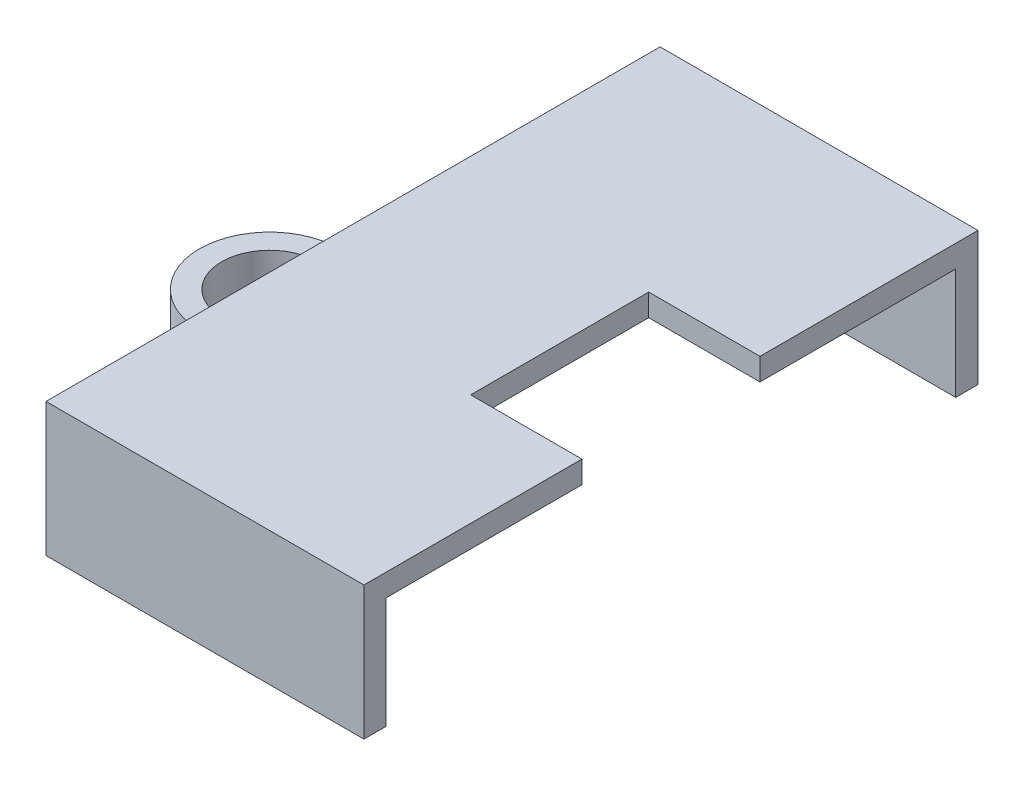
ISO-10303-21;
HEADER;
FILE_DESCRIPTION(('STEP AP214'),'2;1');
FILE_NAME('part.step','',(''),(''),'','','');
FILE_SCHEMA(('AUTOMOTIVE_DESIGN { 1 0 10303 214 1 1 1 1 }'));
ENDSEC;
DATA;
#1=APPLICATION_CONTEXT('core data for automotive mechanical design processes');
#2=APPLICATION_PROTOCOL_DEFINITION('international standard','automotive_design',2000,#1);
#3=PRODUCT_CONTEXT('',#1,'mechanical');
#4=PRODUCT('Part','Part','',(#3));
#5=PRODUCT_RELATED_PRODUCT_CATEGORY('part','',(#4));
#6=PRODUCT_DEFINITION_FORMATION('','',#4);
#7=PRODUCT_DEFINITION_CONTEXT('part definition',#1,'design');
#8=PRODUCT_DEFINITION('design','',#6,#7);
#9=PRODUCT_DEFINITION_SHAPE('','',#8);
#10=(LENGTH_UNIT() NAMED_UNIT(*) SI_UNIT(.MILLI.,.METRE.));
#11=(NAMED_UNIT(*) PLANE_ANGLE_UNIT() SI_UNIT($,.RADIAN.));
#12=(NAMED_UNIT(*) SI_UNIT($,.STERADIAN.) SOLID_ANGLE_UNIT());
#13=UNCERTAINTY_MEASURE_WITH_UNIT(LENGTH_MEASURE(1.E-05),#10,'distance_accuracy_value','');
#14=(GEOMETRIC_REPRESENTATION_CONTEXT(3) GLOBAL_UNCERTAINTY_ASSIGNED_CONTEXT((#13)) GLOBAL_UNIT_ASSIGNED_CONTEXT((#10,
#11,#12)) REPRESENTATION_CONTEXT('',''));
#15=CARTESIAN_POINT('',(0.,0.,0.));
#16=DIRECTION('',(0.,0.,1.));
#17=DIRECTION('',(1.,0.,0.));
#18=AXIS2_PLACEMENT_3D('',#15,#16,#17);
#19=CARTESIAN_POINT('',(0.,6.,13.7963481159043));
#20=DIRECTION('',(0.,0.,1.));
#21=DIRECTION('',(1.,0.,0.));
#22=AXIS2_PLACEMENT_3D('',#19,#20,#21);
#23=PLANE('',#22);
#24=DIRECTION('',(0.,-1.,0.));
#25=VECTOR('',#24,1.);
#26=CARTESIAN_POINT('',(3.75,6.,13.7963481159043));
#27=LINE('',#26,#25);
#28=CARTESIAN_POINT('',(3.75,6.,13.7963481159043));
#29=VERTEX_POINT('',#28);
#30=CARTESIAN_POINT('',(3.75,0.,13.7963481159043));
#31=VERTEX_POINT('',#30);
#32=EDGE_CURVE('E256',#29,#31,#27,.T.);
#33=ORIENTED_EDGE('',*,*,#32,.T.);
#34=DIRECTION('',(-1.,0.,0.));
#35=VECTOR('',#34,1.);
#36=CARTESIAN_POINT('',(0.,0.,13.7963481159043));
#37=LINE('',#36,#35);
#38=CARTESIAN_POINT('',(18.035,0.,13.7963481159043));
#39=VERTEX_POINT('',#38);
#40=EDGE_CURVE('E199',#39,#31,#37,.T.);
#41=ORIENTED_EDGE('',*,*,#40,.F.);
#42=DIRECTION('',(0.,-1.,0.));
#43=VECTOR('',#42,1.);
#44=CARTESIAN_POINT('',(18.035,6.,13.7963481159043));
#45=LINE('',#44,#43);
#46=CARTESIAN_POINT('',(18.035,6.,13.7963481159043));
#47=VERTEX_POINT('',#46);
#48=EDGE_CURVE('E11',#47,#39,#45,.T.);
#49=ORIENTED_EDGE('',*,*,#48,.F.);
#50=DIRECTION('',(-1.,0.,0.));
#51=VECTOR('',#50,1.);
#52=CARTESIAN_POINT('',(0.,6.,13.7963481159043));
#53=LINE('',#52,#51);
#54=EDGE_CURVE('E231',#47,#29,#53,.T.);
#55=ORIENTED_EDGE('',*,*,#54,.T.);
#56=EDGE_LOOP('',(#33,#41,#49,#55));
#57=FACE_BOUND('',#56,.T.);
#58=ADVANCED_FACE('F41',(#57),#23,.T.);
#59=CARTESIAN_POINT('',(18.035,6.,0.));
#60=DIRECTION('',(1.,0.,0.));
#61=DIRECTION('',(0.,0.,-1.));
#62=AXIS2_PLACEMENT_3D('',#59,#60,#61);
#63=PLANE('',#62);
#64=DIRECTION('',(0.,0.,1.));
#65=VECTOR('',#64,1.);
#66=CARTESIAN_POINT('',(18.035,5.,0.));
#67=LINE('',#66,#65);
#68=CARTESIAN_POINT('',(18.035,5.,4.));
#69=VERTEX_POINT('',#68);
#70=CARTESIAN_POINT('',(18.035,5.,12.7963481159043));
#71=VERTEX_POINT('',#70);
#72=EDGE_CURVE('E230',#69,#71,#67,.T.);
#73=ORIENTED_EDGE('',*,*,#72,.F.);
#74=DIRECTION('',(0.,-1.,0.));
#75=VECTOR('',#74,1.);
#76=CARTESIAN_POINT('',(18.035,6.,4.));
#77=LINE('',#76,#75);
#78=CARTESIAN_POINT('',(18.035,6.,4.));
#79=VERTEX_POINT('',#78);
#80=EDGE_CURVE('E48',#79,#69,#77,.T.);
#81=ORIENTED_EDGE('',*,*,#80,.F.);
#82=DIRECTION('',(0.,0.,1.));
#83=VECTOR('',#82,1.);
#84=CARTESIAN_POINT('',(18.035,6.,0.));
#85=LINE('',#84,#83);
#86=EDGE_CURVE('E234',#79,#47,#85,.T.);
#87=ORIENTED_EDGE('',*,*,#86,.T.);
#88=ORIENTED_EDGE('',*,*,#48,.T.);
#89=DIRECTION('',(0.,0.,1.));
#90=VECTOR('',#89,1.);
#91=CARTESIAN_POINT('',(18.035,0.,0.));
#92=LINE('',#91,#90);
#93=CARTESIAN_POINT('',(18.035,0.,12.7963481159043));
#94=VERTEX_POINT('',#93);
#95=EDGE_CURVE('E195',#94,#39,#92,.T.);
#96=ORIENTED_EDGE('',*,*,#95,.F.);
#97=DIRECTION('',(0.,-1.,0.));
#98=VECTOR('',#97,1.);
#99=CARTESIAN_POINT('',(18.035,36.0711781292706,12.7963481159043));
#100=LINE('',#99,#98);
#101=EDGE_CURVE('E222',#71,#94,#100,.T.);
#102=ORIENTED_EDGE('',*,*,#101,.F.);
#103=EDGE_LOOP('',(#73,#81,#87,#88,#96,#102));
#104=FACE_BOUND('',#103,.T.);
#105=ADVANCED_FACE('F288',(#104),#63,.T.);
#106=CARTESIAN_POINT('',(0.,6.,4.));
#107=DIRECTION('',(0.,0.,-1.));
#108=DIRECTION('',(-1.,0.,0.));
#109=AXIS2_PLACEMENT_3D('',#106,#107,#108);
#110=PLANE('',#109);
#111=DIRECTION('',(1.,0.,0.));
#112=VECTOR('',#111,1.);
#113=CARTESIAN_POINT('',(0.,5.,4.));
#114=LINE('',#113,#112);
#115=CARTESIAN_POINT('',(13.035,5.,4.));
#116=VERTEX_POINT('',#115);
#117=EDGE_CURVE('E258',#116,#69,#114,.T.);
#118=ORIENTED_EDGE('',*,*,#117,.F.);
#119=DIRECTION('',(0.,-1.,0.));
#120=VECTOR('',#119,1.);
#121=CARTESIAN_POINT('',(13.035,6.,4.));
#122=LINE('',#121,#120);
#123=CARTESIAN_POINT('',(13.035,6.,4.));
#124=VERTEX_POINT('',#123);
#125=EDGE_CURVE('E279',#124,#116,#122,.T.);
#126=ORIENTED_EDGE('',*,*,#125,.F.);
#127=DIRECTION('',(1.,0.,0.));
#128=VECTOR('',#127,1.);
#129=CARTESIAN_POINT('',(0.,6.,4.));
#130=LINE('',#129,#128);
#131=EDGE_CURVE('E238',#124,#79,#130,.T.);
#132=ORIENTED_EDGE('',*,*,#131,.T.);
#133=ORIENTED_EDGE('',*,*,#80,.T.);
#134=EDGE_LOOP('',(#118,#126,#132,#133));
#135=FACE_BOUND('',#134,.T.);
#136=ADVANCED_FACE('F283',(#135),#110,.T.);
#137=CARTESIAN_POINT('',(13.035,6.,0.));
#138=DIRECTION('',(1.,0.,0.));
#139=DIRECTION('',(0.,0.,-1.));
#140=AXIS2_PLACEMENT_3D('',#137,#138,#139);
#141=PLANE('',#140);
#142=DIRECTION('',(0.,0.,1.));
#143=VECTOR('',#142,1.);
#144=CARTESIAN_POINT('',(13.035,5.,0.));
#145=LINE('',#144,#143);
#146=CARTESIAN_POINT('',(13.035,5.,-4.));
#147=VERTEX_POINT('',#146);
#148=EDGE_CURVE('E261',#147,#116,#145,.T.);
#149=ORIENTED_EDGE('',*,*,#148,.F.);
#150=DIRECTION('',(0.,-1.,0.));
#151=VECTOR('',#150,1.);
#152=CARTESIAN_POINT('',(13.035,6.,-4.));
#153=LINE('',#152,#151);
#154=CARTESIAN_POINT('',(13.035,6.,-4.));
#155=VERTEX_POINT('',#154);
#156=EDGE_CURVE('E277',#155,#147,#153,.T.);
#157=ORIENTED_EDGE('',*,*,#156,.F.);
#158=DIRECTION('',(0.,0.,1.));
#159=VECTOR('',#158,1.);
#160=CARTESIAN_POINT('',(13.035,6.,0.));
#161=LINE('',#160,#159);
#162=EDGE_CURVE('E241',#155,#124,#161,.T.);
#163=ORIENTED_EDGE('',*,*,#162,.T.);
#164=ORIENTED_EDGE('',*,*,#125,.T.);
#165=EDGE_LOOP('',(#149,#157,#163,#164));
#166=FACE_BOUND('',#165,.T.);
#167=ADVANCED_FACE('F294',(#166),#141,.T.);
#168=CARTESIAN_POINT('',(0.,6.,-4.));
#169=DIRECTION('',(0.,0.,1.));
#170=DIRECTION('',(1.,0.,0.));
#171=AXIS2_PLACEMENT_3D('',#168,#169,#170);
#172=PLANE('',#171);
#173=DIRECTION('',(-1.,0.,0.));
#174=VECTOR('',#173,1.);
#175=CARTESIAN_POINT('',(0.,5.,-4.));
#176=LINE('',#175,#174);
#177=CARTESIAN_POINT('',(18.035,5.,-4.));
#178=VERTEX_POINT('',#177);
#179=EDGE_CURVE('E264',#178,#147,#176,.T.);
#180=ORIENTED_EDGE('',*,*,#179,.F.);
#181=DIRECTION('',(0.,-1.,0.));
#182=VECTOR('',#181,1.);
#183=CARTESIAN_POINT('',(18.035,6.,-4.));
#184=LINE('',#183,#182);
#185=CARTESIAN_POINT('',(18.035,6.,-4.));
#186=VERTEX_POINT('',#185);
#187=EDGE_CURVE('E274',#186,#178,#184,.T.);
#188=ORIENTED_EDGE('',*,*,#187,.F.);
#189=DIRECTION('',(-1.,0.,0.));
#190=VECTOR('',#189,1.);
#191=CARTESIAN_POINT('',(0.,6.,-4.));
#192=LINE('',#191,#190);
#193=EDGE_CURVE('E244',#186,#155,#192,.T.);
#194=ORIENTED_EDGE('',*,*,#193,.T.);
#195=ORIENTED_EDGE('',*,*,#156,.T.);
#196=EDGE_LOOP('',(#180,#188,#194,#195));
#197=FACE_BOUND('',#196,.T.);
#198=ADVANCED_FACE('F325',(#197),#172,.T.);
#199=CARTESIAN_POINT('',(18.035,6.,0.));
#200=DIRECTION('',(1.,0.,0.));
#201=DIRECTION('',(0.,0.,-1.));
#202=AXIS2_PLACEMENT_3D('',#199,#200,#201);
#203=PLANE('',#202);
#204=DIRECTION('',(0.,0.,1.));
#205=VECTOR('',#204,1.);
#206=CARTESIAN_POINT('',(18.035,5.,0.));
#207=LINE('',#206,#205);
#208=CARTESIAN_POINT('',(18.035,5.,-12.7963481159043));
#209=VERTEX_POINT('',#208);
#210=EDGE_CURVE('E235',#209,#178,#207,.T.);
#211=ORIENTED_EDGE('',*,*,#210,.F.);
#212=DIRECTION('',(0.,-1.,0.));
#213=VECTOR('',#212,1.);
#214=CARTESIAN_POINT('',(18.035,36.0711781292706,-12.7963481159043));
#215=LINE('',#214,#213);
#216=CARTESIAN_POINT('',(18.035,0.,-12.7963481159043));
#217=VERTEX_POINT('',#216);
#218=EDGE_CURVE('E206',#209,#217,#215,.T.);
#219=ORIENTED_EDGE('',*,*,#218,.T.);
#220=DIRECTION('',(0.,0.,1.));
#221=VECTOR('',#220,1.);
#222=CARTESIAN_POINT('',(18.035,0.,0.));
#223=LINE('',#222,#221);
#224=CARTESIAN_POINT('',(18.035,0.,-13.7963481159043));
#225=VERTEX_POINT('',#224);
#226=EDGE_CURVE('E210',#225,#217,#223,.T.);
#227=ORIENTED_EDGE('',*,*,#226,.F.);
#228=DIRECTION('',(0.,-1.,0.));
#229=VECTOR('',#228,1.);
#230=CARTESIAN_POINT('',(18.035,6.,-13.7963481159043));
#231=LINE('',#230,#229);
#232=CARTESIAN_POINT('',(18.035,6.,-13.7963481159043));
#233=VERTEX_POINT('',#232);
#234=EDGE_CURVE('E272',#233,#225,#231,.T.);
#235=ORIENTED_EDGE('',*,*,#234,.F.);
#236=DIRECTION('',(0.,0.,1.));
#237=VECTOR('',#236,1.);
#238=CARTESIAN_POINT('',(18.035,6.,0.));
#239=LINE('',#238,#237);
#240=EDGE_CURVE('E247',#233,#186,#239,.T.);
#241=ORIENTED_EDGE('',*,*,#240,.T.);
#242=ORIENTED_EDGE('',*,*,#187,.T.);
#243=EDGE_LOOP('',(#211,#219,#227,#235,#241,#242));
#244=FACE_BOUND('',#243,.T.);
#245=ADVANCED_FACE('F321',(#244),#203,.T.);
#246=CARTESIAN_POINT('',(0.,6.,-13.7963481159043));
#247=DIRECTION('',(0.,0.,-1.));
#248=DIRECTION('',(-1.,0.,0.));
#249=AXIS2_PLACEMENT_3D('',#246,#247,#248);
#250=PLANE('',#249);
#251=ORIENTED_EDGE('',*,*,#234,.T.);
#252=DIRECTION('',(1.,0.,0.));
#253=VECTOR('',#252,1.);
#254=CARTESIAN_POINT('',(0.,0.,-13.7963481159043));
#255=LINE('',#254,#253);
#256=CARTESIAN_POINT('',(3.75,0.,-13.7963481159043));
#257=VERTEX_POINT('',#256);
#258=EDGE_CURVE('E202',#257,#225,#255,.T.);
#259=ORIENTED_EDGE('',*,*,#258,.F.);
#260=DIRECTION('',(0.,-1.,0.));
#261=VECTOR('',#260,1.);
#262=CARTESIAN_POINT('',(3.75,6.,-13.7963481159043));
#263=LINE('',#262,#261);
#264=CARTESIAN_POINT('',(3.75,6.,-13.7963481159043));
#265=VERTEX_POINT('',#264);
#266=EDGE_CURVE('E270',#265,#257,#263,.T.);
#267=ORIENTED_EDGE('',*,*,#266,.F.);
#268=DIRECTION('',(1.,0.,0.));
#269=VECTOR('',#268,1.);
#270=CARTESIAN_POINT('',(0.,6.,-13.7963481159043));
#271=LINE('',#270,#269);
#272=EDGE_CURVE('E250',#265,#233,#271,.T.);
#273=ORIENTED_EDGE('',*,*,#272,.T.);
#274=EDGE_LOOP('',(#251,#259,#267,#273));
#275=FACE_BOUND('',#274,.T.);
#276=ADVANCED_FACE('F328',(#275),#250,.T.);
#277=CARTESIAN_POINT('',(3.75,6.,0.));
#278=DIRECTION('',(-1.,0.,0.));
#279=DIRECTION('',(0.,0.,1.));
#280=AXIS2_PLACEMENT_3D('',#277,#278,#279);
#281=PLANE('',#280);
#282=DIRECTION('',(0.,-1.,0.));
#283=VECTOR('',#282,1.);
#284=CARTESIAN_POINT('',(3.75,1.5875,-3.15265));
#285=LINE('',#284,#283);
#286=CARTESIAN_POINT('',(3.75,1.5875,-3.15265));
#287=VERTEX_POINT('',#286);
#288=CARTESIAN_POINT('',(3.75,0.,-3.15265));
#289=VERTEX_POINT('',#288);
#290=EDGE_CURVE('E189',#287,#289,#285,.T.);
#291=ORIENTED_EDGE('',*,*,#290,.F.);
#292=DIRECTION('',(0.,0.,1.));
#293=VECTOR('',#292,1.);
#294=CARTESIAN_POINT('',(3.75,1.5875,0.));
#295=LINE('',#294,#293);
#296=CARTESIAN_POINT('',(3.75,1.5875,3.15265));
#297=VERTEX_POINT('',#296);
#298=EDGE_CURVE('E173',#287,#297,#295,.T.);
#299=ORIENTED_EDGE('',*,*,#298,.T.);
#300=DIRECTION('',(0.,-1.,0.));
#301=VECTOR('',#300,1.);
#302=CARTESIAN_POINT('',(3.75,1.5875,3.15265));
#303=LINE('',#302,#301);
#304=CARTESIAN_POINT('',(3.75,0.,3.15265));
#305=VERTEX_POINT('',#304);
#306=EDGE_CURVE('E170',#297,#305,#303,.T.);
#307=ORIENTED_EDGE('',*,*,#306,.T.);
#308=DIRECTION('',(0.,0.,1.));
#309=VECTOR('',#308,1.);
#310=CARTESIAN_POINT('',(3.75,0.,0.));
#311=LINE('',#310,#309);
#312=EDGE_CURVE('E207',#305,#31,#311,.T.);
#313=ORIENTED_EDGE('',*,*,#312,.T.);
#314=ORIENTED_EDGE('',*,*,#32,.F.);
#315=DIRECTION('',(0.,0.,-1.));
#316=VECTOR('',#315,1.);
#317=CARTESIAN_POINT('',(3.75,6.,0.));
#318=LINE('',#317,#316);
#319=EDGE_CURVE('E253',#29,#265,#318,.T.);
#320=ORIENTED_EDGE('',*,*,#319,.T.);
#321=ORIENTED_EDGE('',*,*,#266,.T.);
#322=EDGE_CURVE('E203',#257,#289,#311,.T.);
#323=ORIENTED_EDGE('',*,*,#322,.T.);
#324=EDGE_LOOP('',(#291,#299,#307,#313,#314,#320,#321,#323));
#325=FACE_BOUND('',#324,.T.);
#326=ADVANCED_FACE('F333',(#325),#281,.T.);
#327=CARTESIAN_POINT('',(0.,6.,0.));
#328=DIRECTION('',(0.,1.,0.));
#329=DIRECTION('',(0.,0.,1.));
#330=AXIS2_PLACEMENT_3D('',#327,#328,#329);
#331=PLANE('',#330);
#332=ORIENTED_EDGE('',*,*,#54,.F.);
#333=ORIENTED_EDGE('',*,*,#86,.F.);
#334=ORIENTED_EDGE('',*,*,#131,.F.);
#335=ORIENTED_EDGE('',*,*,#162,.F.);
#336=ORIENTED_EDGE('',*,*,#193,.F.);
#337=ORIENTED_EDGE('',*,*,#240,.F.);
#338=ORIENTED_EDGE('',*,*,#272,.F.);
#339=ORIENTED_EDGE('',*,*,#319,.F.);
#340=EDGE_LOOP('',(#332,#333,#334,#335,#336,#337,#338,#339));
#341=FACE_BOUND('',#340,.T.);
#342=ADVANCED_FACE('F298',(#341),#331,.T.);
#343=CARTESIAN_POINT('',(0.,5.,0.));
#344=DIRECTION('',(0.,1.,0.));
#345=DIRECTION('',(0.,0.,1.));
#346=AXIS2_PLACEMENT_3D('',#343,#344,#345);
#347=PLANE('',#346);
#348=DIRECTION('',(0.,0.,1.));
#349=VECTOR('',#348,1.);
#350=CARTESIAN_POINT('',(4.75,5.,0.));
#351=LINE('',#350,#349);
#352=CARTESIAN_POINT('',(4.75,5.,-12.7963481159043));
#353=VERTEX_POINT('',#352);
#354=CARTESIAN_POINT('',(4.75,5.,12.7963481159043));
#355=VERTEX_POINT('',#354);
#356=EDGE_CURVE('E63',#353,#355,#351,.T.);
#357=ORIENTED_EDGE('',*,*,#356,.F.);
#358=DIRECTION('',(1.,0.,0.));
#359=VECTOR('',#358,1.);
#360=CARTESIAN_POINT('',(0.,5.,-12.7963481159043));
#361=LINE('',#360,#359);
#362=EDGE_CURVE('E169',#353,#209,#361,.T.);
#363=ORIENTED_EDGE('',*,*,#362,.T.);
#364=ORIENTED_EDGE('',*,*,#210,.T.);
#365=ORIENTED_EDGE('',*,*,#179,.T.);
#366=ORIENTED_EDGE('',*,*,#148,.T.);
#367=ORIENTED_EDGE('',*,*,#117,.T.);
#368=ORIENTED_EDGE('',*,*,#72,.T.);
#369=DIRECTION('',(1.,0.,0.));
#370=VECTOR('',#369,1.);
#371=CARTESIAN_POINT('',(0.,5.,12.7963481159043));
#372=LINE('',#371,#370);
#373=EDGE_CURVE('E213',#355,#71,#372,.T.);
#374=ORIENTED_EDGE('',*,*,#373,.F.);
#375=EDGE_LOOP('',(#357,#363,#364,#365,#366,#367,#368,#374));
#376=FACE_BOUND('',#375,.T.);
#377=ADVANCED_FACE('F290',(#376),#347,.F.);
#378=CARTESIAN_POINT('',(0.,0.,0.));
#379=DIRECTION('',(0.,1.,0.));
#380=DIRECTION('',(0.,0.,1.));
#381=AXIS2_PLACEMENT_3D('',#378,#379,#380);
#382=PLANE('',#381);
#383=DIRECTION('',(0.,0.,1.));
#384=VECTOR('',#383,1.);
#385=CARTESIAN_POINT('',(4.75,0.,0.));
#386=LINE('',#385,#384);
#387=CARTESIAN_POINT('',(4.75,0.,-12.7963481159043));
#388=VERTEX_POINT('',#387);
#389=CARTESIAN_POINT('',(4.75,0.,12.7963481159043));
#390=VERTEX_POINT('',#389);
#391=EDGE_CURVE('E196',#388,#390,#386,.T.);
#392=ORIENTED_EDGE('',*,*,#391,.T.);
#393=DIRECTION('',(1.,0.,0.));
#394=VECTOR('',#393,1.);
#395=CARTESIAN_POINT('',(0.,0.,12.7963481159043));
#396=LINE('',#395,#394);
#397=EDGE_CURVE('E192',#390,#94,#396,.T.);
#398=ORIENTED_EDGE('',*,*,#397,.T.);
#399=ORIENTED_EDGE('',*,*,#95,.T.);
#400=ORIENTED_EDGE('',*,*,#40,.T.);
#401=ORIENTED_EDGE('',*,*,#312,.F.);
#402=DIRECTION('',(-1.,0.,0.));
#403=VECTOR('',#402,1.);
#404=CARTESIAN_POINT('',(0.,0.,3.15265));
#405=LINE('',#404,#403);
#406=CARTESIAN_POINT('',(0.,0.,3.15265));
#407=VERTEX_POINT('',#406);
#408=EDGE_CURVE('E55',#305,#407,#405,.T.);
#409=ORIENTED_EDGE('',*,*,#408,.T.);
#410=CARTESIAN_POINT('',(0.,0.,0.));
#411=DIRECTION('',(0.,1.,0.));
#412=DIRECTION('',(0.,0.,1.));
#413=AXIS2_PLACEMENT_3D('',#410,#411,#412);
#414=CIRCLE('',#413,3.15265);
#415=CARTESIAN_POINT('',(0.,0.,-3.15265));
#416=VERTEX_POINT('',#415);
#417=EDGE_CURVE('E168',#416,#407,#414,.T.);
#418=ORIENTED_EDGE('',*,*,#417,.F.);
#419=DIRECTION('',(1.,0.,0.));
#420=VECTOR('',#419,1.);
#421=CARTESIAN_POINT('',(0.,0.,-3.15265));
#422=LINE('',#421,#420);
#423=EDGE_CURVE('E185',#416,#289,#422,.T.);
#424=ORIENTED_EDGE('',*,*,#423,.T.);
#425=ORIENTED_EDGE('',*,*,#322,.F.);
#426=ORIENTED_EDGE('',*,*,#258,.T.);
#427=ORIENTED_EDGE('',*,*,#226,.T.);
#428=DIRECTION('',(1.,0.,0.));
#429=VECTOR('',#428,1.);
#430=CARTESIAN_POINT('',(0.,0.,-12.7963481159043));
#431=LINE('',#430,#429);
#432=EDGE_CURVE('E214',#388,#217,#431,.T.);
#433=ORIENTED_EDGE('',*,*,#432,.F.);
#434=EDGE_LOOP('',(#392,#398,#399,#400,#401,#409,#418,#424,#425,#426,#427,#433));
#435=FACE_BOUND('',#434,.T.);
#436=CARTESIAN_POINT('',(0.,0.,0.));
#437=DIRECTION('',(0.,1.,0.));
#438=DIRECTION('',(0.,0.,1.));
#439=AXIS2_PLACEMENT_3D('',#436,#437,#438);
#440=CIRCLE('',#439,2.15265);
#441=CARTESIAN_POINT('',(0.,0.,2.15265));
#442=VERTEX_POINT('',#441);
#443=EDGE_CURVE('E180',#442,#442,#440,.T.);
#444=ORIENTED_EDGE('',*,*,#443,.T.);
#445=EDGE_LOOP('',(#444));
#446=FACE_BOUND('',#445,.T.);
#447=ADVANCED_FACE('F305',(#435,#446),#382,.F.);
#448=CARTESIAN_POINT('',(0.,36.0711781292706,12.7963481159043));
#449=DIRECTION('',(0.,0.,-1.));
#450=DIRECTION('',(-1.,0.,0.));
#451=AXIS2_PLACEMENT_3D('',#448,#449,#450);
#452=PLANE('',#451);
#453=DIRECTION('',(0.,-1.,0.));
#454=VECTOR('',#453,1.);
#455=CARTESIAN_POINT('',(4.75,36.0711781292706,12.7963481159043));
#456=LINE('',#455,#454);
#457=EDGE_CURVE('E224',#355,#390,#456,.T.);
#458=ORIENTED_EDGE('',*,*,#457,.F.);
#459=ORIENTED_EDGE('',*,*,#373,.T.);
#460=ORIENTED_EDGE('',*,*,#101,.T.);
#461=ORIENTED_EDGE('',*,*,#397,.F.);
#462=EDGE_LOOP('',(#458,#459,#460,#461));
#463=FACE_BOUND('',#462,.T.);
#464=ADVANCED_FACE('F312',(#463),#452,.T.);
#465=CARTESIAN_POINT('',(0.,36.0711781292706,-12.7963481159043));
#466=DIRECTION('',(0.,0.,-1.));
#467=DIRECTION('',(-1.,0.,0.));
#468=AXIS2_PLACEMENT_3D('',#465,#466,#467);
#469=PLANE('',#468);
#470=ORIENTED_EDGE('',*,*,#362,.F.);
#471=DIRECTION('',(0.,-1.,0.));
#472=VECTOR('',#471,1.);
#473=CARTESIAN_POINT('',(4.75,36.0711781292706,-12.7963481159043));
#474=LINE('',#473,#472);
#475=EDGE_CURVE('E217',#353,#388,#474,.T.);
#476=ORIENTED_EDGE('',*,*,#475,.T.);
#477=ORIENTED_EDGE('',*,*,#432,.T.);
#478=ORIENTED_EDGE('',*,*,#218,.F.);
#479=EDGE_LOOP('',(#470,#476,#477,#478));
#480=FACE_BOUND('',#479,.T.);
#481=ADVANCED_FACE('F318',(#480),#469,.F.);
#482=CARTESIAN_POINT('',(4.75,36.0711781292706,0.));
#483=DIRECTION('',(1.,0.,0.));
#484=DIRECTION('',(0.,0.,-1.));
#485=AXIS2_PLACEMENT_3D('',#482,#483,#484);
#486=PLANE('',#485);
#487=ORIENTED_EDGE('',*,*,#475,.F.);
#488=ORIENTED_EDGE('',*,*,#356,.T.);
#489=ORIENTED_EDGE('',*,*,#457,.T.);
#490=ORIENTED_EDGE('',*,*,#391,.F.);
#491=EDGE_LOOP('',(#487,#488,#489,#490));
#492=FACE_BOUND('',#491,.T.);
#493=ADVANCED_FACE('F314',(#492),#486,.T.);
#494=CARTESIAN_POINT('',(0.,1.5875,0.));
#495=DIRECTION('',(0.,-1.,0.));
#496=DIRECTION('',(0.,0.,-1.));
#497=AXIS2_PLACEMENT_3D('',#494,#495,#496);
#498=CYLINDRICAL_SURFACE('',#497,3.15265);
#499=ORIENTED_EDGE('',*,*,#417,.T.);
#500=DIRECTION('',(0.,-1.,0.));
#501=VECTOR('',#500,1.);
#502=CARTESIAN_POINT('',(0.,1.5875,3.15265));
#503=LINE('',#502,#501);
#504=CARTESIAN_POINT('',(0.,1.5875,3.15265));
#505=VERTEX_POINT('',#504);
#506=EDGE_CURVE('E165',#505,#407,#503,.T.);
#507=ORIENTED_EDGE('',*,*,#506,.F.);
#508=CARTESIAN_POINT('',(0.,1.5875,0.));
#509=DIRECTION('',(0.,1.,0.));
#510=DIRECTION('',(0.,0.,1.));
#511=AXIS2_PLACEMENT_3D('',#508,#509,#510);
#512=CIRCLE('',#511,3.15265);
#513=CARTESIAN_POINT('',(0.,1.5875,-3.15265));
#514=VERTEX_POINT('',#513);
#515=EDGE_CURVE('E153',#514,#505,#512,.T.);
#516=ORIENTED_EDGE('',*,*,#515,.F.);
#517=DIRECTION('',(0.,-1.,0.));
#518=VECTOR('',#517,1.);
#519=CARTESIAN_POINT('',(0.,1.5875,-3.15265));
#520=LINE('',#519,#518);
#521=EDGE_CURVE('E179',#514,#416,#520,.T.);
#522=ORIENTED_EDGE('',*,*,#521,.T.);
#523=EDGE_LOOP('',(#499,#507,#516,#522));
#524=FACE_BOUND('',#523,.T.);
#525=ADVANCED_FACE('F166',(#524),#498,.T.);
#526=CARTESIAN_POINT('',(0.,1.5875,3.15265));
#527=DIRECTION('',(0.,0.,1.));
#528=DIRECTION('',(1.,0.,0.));
#529=AXIS2_PLACEMENT_3D('',#526,#527,#528);
#530=PLANE('',#529);
#531=ORIENTED_EDGE('',*,*,#408,.F.);
#532=ORIENTED_EDGE('',*,*,#306,.F.);
#533=DIRECTION('',(-1.,0.,0.));
#534=VECTOR('',#533,1.);
#535=CARTESIAN_POINT('',(0.,1.5875,3.15265));
#536=LINE('',#535,#534);
#537=EDGE_CURVE('E157',#297,#505,#536,.T.);
#538=ORIENTED_EDGE('',*,*,#537,.T.);
#539=ORIENTED_EDGE('',*,*,#506,.T.);
#540=EDGE_LOOP('',(#531,#532,#538,#539));
#541=FACE_BOUND('',#540,.T.);
#542=ADVANCED_FACE('F172',(#541),#530,.T.);
#543=CARTESIAN_POINT('',(0.,1.5875,0.));
#544=DIRECTION('',(0.,-1.,0.));
#545=DIRECTION('',(0.,0.,-1.));
#546=AXIS2_PLACEMENT_3D('',#543,#544,#545);
#547=CYLINDRICAL_SURFACE('',#546,2.15265);
#548=CARTESIAN_POINT('',(0.,1.5875,0.));
#549=DIRECTION('',(0.,1.,0.));
#550=DIRECTION('',(0.,0.,1.));
#551=AXIS2_PLACEMENT_3D('',#548,#549,#550);
#552=CIRCLE('',#551,2.15265);
#553=CARTESIAN_POINT('',(0.,1.5875,2.15265));
#554=VERTEX_POINT('',#553);
#555=EDGE_CURVE('E162',#554,#554,#552,.T.);
#556=ORIENTED_EDGE('',*,*,#555,.T.);
#557=EDGE_LOOP('',(#556));
#558=FACE_BOUND('',#557,.T.);
#559=ORIENTED_EDGE('',*,*,#443,.F.);
#560=EDGE_LOOP('',(#559));
#561=FACE_BOUND('',#560,.T.);
#562=ADVANCED_FACE('F338',(#558,#561),#547,.F.);
#563=CARTESIAN_POINT('',(0.,1.5875,-3.15265));
#564=DIRECTION('',(0.,0.,-1.));
#565=DIRECTION('',(-1.,0.,0.));
#566=AXIS2_PLACEMENT_3D('',#563,#564,#565);
#567=PLANE('',#566);
#568=ORIENTED_EDGE('',*,*,#423,.F.);
#569=ORIENTED_EDGE('',*,*,#521,.F.);
#570=DIRECTION('',(1.,0.,0.));
#571=VECTOR('',#570,1.);
#572=CARTESIAN_POINT('',(0.,1.5875,-3.15265));
#573=LINE('',#572,#571);
#574=EDGE_CURVE('E160',#514,#287,#573,.T.);
#575=ORIENTED_EDGE('',*,*,#574,.T.);
#576=ORIENTED_EDGE('',*,*,#290,.T.);
#577=EDGE_LOOP('',(#568,#569,#575,#576));
#578=FACE_BOUND('',#577,.T.);
#579=ADVANCED_FACE('F336',(#578),#567,.T.);
#580=CARTESIAN_POINT('',(0.,1.5875,0.));
#581=DIRECTION('',(0.,1.,0.));
#582=DIRECTION('',(0.,0.,1.));
#583=AXIS2_PLACEMENT_3D('',#580,#581,#582);
#584=PLANE('',#583);
#585=ORIENTED_EDGE('',*,*,#555,.F.);
#586=EDGE_LOOP('',(#585));
#587=FACE_BOUND('',#586,.T.);
#588=ORIENTED_EDGE('',*,*,#515,.T.);
#589=ORIENTED_EDGE('',*,*,#537,.F.);
#590=ORIENTED_EDGE('',*,*,#298,.F.);
#591=ORIENTED_EDGE('',*,*,#574,.F.);
#592=EDGE_LOOP('',(#588,#589,#590,#591));
#593=FACE_BOUND('',#592,.T.);
#594=ADVANCED_FACE('F155',(#587,#593),#584,.T.);
#595=CLOSED_SHELL('',(#58,#105,#136,#167,#198,#245,#276,#326,#342,#377,#447,#464,#481,#493,#525,
#542,#562,#579,#594));
#596=MANIFOLD_SOLID_BREP('B2',#595);
#597=ADVANCED_BREP_SHAPE_REPRESENTATION('',(#18,#596),#14);
#598=SHAPE_DEFINITION_REPRESENTATION(#9,#597);
ENDSEC;
END-ISO-10303-21;
